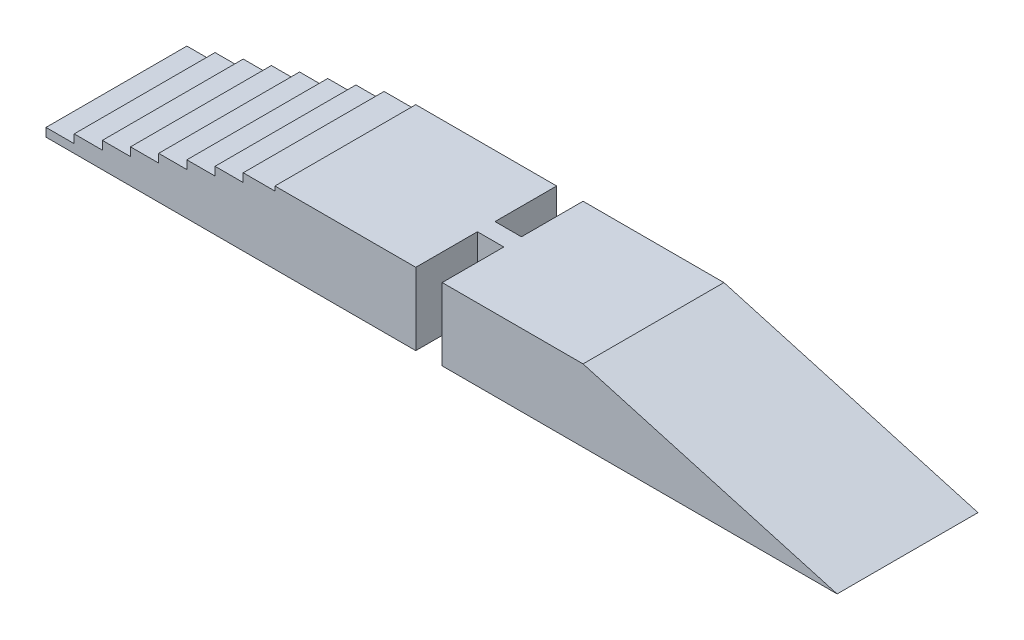
ISO-10303-21;
HEADER;
FILE_DESCRIPTION(('STEP AP214'),'2;1');
FILE_NAME('part.step','',(''),(''),'','','');
FILE_SCHEMA(('AUTOMOTIVE_DESIGN { 1 0 10303 214 1 1 1 1 }'));
ENDSEC;
DATA;
#1=APPLICATION_CONTEXT('core data for automotive mechanical design processes');
#2=APPLICATION_PROTOCOL_DEFINITION('international standard','automotive_design',2000,#1);
#3=PRODUCT_CONTEXT('',#1,'mechanical');
#4=PRODUCT('Part','Part','',(#3));
#5=PRODUCT_RELATED_PRODUCT_CATEGORY('part','',(#4));
#6=PRODUCT_DEFINITION_FORMATION('','',#4);
#7=PRODUCT_DEFINITION_CONTEXT('part definition',#1,'design');
#8=PRODUCT_DEFINITION('design','',#6,#7);
#9=PRODUCT_DEFINITION_SHAPE('','',#8);
#10=(LENGTH_UNIT() NAMED_UNIT(*) SI_UNIT(.MILLI.,.METRE.));
#11=(NAMED_UNIT(*) PLANE_ANGLE_UNIT() SI_UNIT($,.RADIAN.));
#12=(NAMED_UNIT(*) SI_UNIT($,.STERADIAN.) SOLID_ANGLE_UNIT());
#13=UNCERTAINTY_MEASURE_WITH_UNIT(LENGTH_MEASURE(1.E-05),#10,'distance_accuracy_value','');
#14=(GEOMETRIC_REPRESENTATION_CONTEXT(3) GLOBAL_UNCERTAINTY_ASSIGNED_CONTEXT((#13)) GLOBAL_UNIT_ASSIGNED_CONTEXT((#10,
#11,#12)) REPRESENTATION_CONTEXT('',''));
#15=CARTESIAN_POINT('',(0.,0.,0.));
#16=DIRECTION('',(0.,0.,1.));
#17=DIRECTION('',(1.,0.,0.));
#18=AXIS2_PLACEMENT_3D('',#15,#16,#17);
#19=CARTESIAN_POINT('',(-1186.89854742721,0.,800.));
#20=DIRECTION('',(0.,1.,0.));
#21=DIRECTION('',(0.,0.,1.));
#22=AXIS2_PLACEMENT_3D('',#19,#20,#21);
#23=PLANE('',#22);
#24=DIRECTION('',(0.,0.,-1.));
#25=VECTOR('',#24,1.);
#26=CARTESIAN_POINT('',(913.101452572792,0.,800.));
#27=LINE('',#26,#25);
#28=CARTESIAN_POINT('',(913.101452572792,0.,350.));
#29=VERTEX_POINT('',#28);
#30=CARTESIAN_POINT('',(913.101452572792,0.,0.));
#31=VERTEX_POINT('',#30);
#32=EDGE_CURVE('E275',#29,#31,#27,.T.);
#33=ORIENTED_EDGE('',*,*,#32,.F.);
#34=DIRECTION('',(1.,0.,0.));
#35=VECTOR('',#34,1.);
#36=CARTESIAN_POINT('',(-1186.89854742721,0.,350.));
#37=LINE('',#36,#35);
#38=CARTESIAN_POINT('',(1063.10145257279,0.,350.));
#39=VERTEX_POINT('',#38);
#40=EDGE_CURVE('E286',#29,#39,#37,.T.);
#41=ORIENTED_EDGE('',*,*,#40,.T.);
#42=DIRECTION('',(0.,0.,-1.));
#43=VECTOR('',#42,1.);
#44=CARTESIAN_POINT('',(1063.10145257279,0.,800.));
#45=LINE('',#44,#43);
#46=CARTESIAN_POINT('',(1063.10145257279,0.,0.));
#47=VERTEX_POINT('',#46);
#48=EDGE_CURVE('E227',#39,#47,#45,.T.);
#49=ORIENTED_EDGE('',*,*,#48,.T.);
#50=DIRECTION('',(1.,0.,0.));
#51=VECTOR('',#50,1.);
#52=CARTESIAN_POINT('',(-1186.89854742721,0.,0.));
#53=LINE('',#52,#51);
#54=CARTESIAN_POINT('',(3305.98051888431,0.,0.));
#55=VERTEX_POINT('',#54);
#56=EDGE_CURVE('E406',#47,#55,#53,.T.);
#57=ORIENTED_EDGE('',*,*,#56,.T.);
#58=DIRECTION('',(0.,0.,-1.));
#59=VECTOR('',#58,1.);
#60=CARTESIAN_POINT('',(3305.98051888431,0.,800.));
#61=LINE('',#60,#59);
#62=CARTESIAN_POINT('',(3305.98051888431,0.,800.));
#63=VERTEX_POINT('',#62);
#64=EDGE_CURVE('E419',#63,#55,#61,.T.);
#65=ORIENTED_EDGE('',*,*,#64,.F.);
#66=DIRECTION('',(1.,0.,0.));
#67=VECTOR('',#66,1.);
#68=CARTESIAN_POINT('',(-1186.89854742721,0.,800.));
#69=LINE('',#68,#67);
#70=CARTESIAN_POINT('',(1063.10145257279,0.,800.));
#71=VERTEX_POINT('',#70);
#72=EDGE_CURVE('E346',#71,#63,#69,.T.);
#73=ORIENTED_EDGE('',*,*,#72,.F.);
#74=DIRECTION('',(0.,0.,-1.));
#75=VECTOR('',#74,1.);
#76=CARTESIAN_POINT('',(1063.10145257279,0.,800.));
#77=LINE('',#76,#75);
#78=CARTESIAN_POINT('',(1063.10145257279,0.,450.));
#79=VERTEX_POINT('',#78);
#80=EDGE_CURVE('E55',#71,#79,#77,.T.);
#81=ORIENTED_EDGE('',*,*,#80,.T.);
#82=DIRECTION('',(1.,0.,0.));
#83=VECTOR('',#82,1.);
#84=CARTESIAN_POINT('',(-1186.89854742721,0.,450.));
#85=LINE('',#84,#83);
#86=CARTESIAN_POINT('',(913.101452572792,0.,450.));
#87=VERTEX_POINT('',#86);
#88=EDGE_CURVE('E283',#87,#79,#85,.T.);
#89=ORIENTED_EDGE('',*,*,#88,.F.);
#90=DIRECTION('',(0.,0.,-1.));
#91=VECTOR('',#90,1.);
#92=CARTESIAN_POINT('',(913.101452572792,0.,800.000000000001));
#93=LINE('',#92,#91);
#94=CARTESIAN_POINT('',(913.101452572792,0.,800.));
#95=VERTEX_POINT('',#94);
#96=EDGE_CURVE('E280',#95,#87,#93,.T.);
#97=ORIENTED_EDGE('',*,*,#96,.F.);
#98=CARTESIAN_POINT('',(-1186.89854742721,0.,800.));
#99=VERTEX_POINT('',#98);
#100=EDGE_CURVE('E347',#99,#95,#69,.T.);
#101=ORIENTED_EDGE('',*,*,#100,.F.);
#102=DIRECTION('',(0.,0.,-1.));
#103=VECTOR('',#102,1.);
#104=CARTESIAN_POINT('',(-1186.89854742721,0.,800.));
#105=LINE('',#104,#103);
#106=CARTESIAN_POINT('',(-1186.89854742721,0.,0.));
#107=VERTEX_POINT('',#106);
#108=EDGE_CURVE('E423',#99,#107,#105,.T.);
#109=ORIENTED_EDGE('',*,*,#108,.T.);
#110=EDGE_CURVE('E407',#107,#31,#53,.T.);
#111=ORIENTED_EDGE('',*,*,#110,.T.);
#112=EDGE_LOOP('',(#33,#41,#49,#57,#65,#73,#81,#89,#97,#101,#109,#111));
#113=FACE_BOUND('',#112,.T.);
#114=ADVANCED_FACE('F39',(#113),#23,.F.);
#115=CARTESIAN_POINT('',(1063.10145257279,410.,800.));
#116=DIRECTION('',(0.,-1.,0.));
#117=DIRECTION('',(0.,0.,-1.));
#118=AXIS2_PLACEMENT_3D('',#115,#116,#117);
#119=PLANE('',#118);
#120=DIRECTION('',(0.,0.,-1.));
#121=VECTOR('',#120,1.);
#122=CARTESIAN_POINT('',(913.101452572792,410.,0.));
#123=LINE('',#122,#121);
#124=CARTESIAN_POINT('',(913.101452572792,410.,350.));
#125=VERTEX_POINT('',#124);
#126=CARTESIAN_POINT('',(913.101452572792,410.,0.));
#127=VERTEX_POINT('',#126);
#128=EDGE_CURVE('E232',#125,#127,#123,.T.);
#129=ORIENTED_EDGE('',*,*,#128,.T.);
#130=DIRECTION('',(-1.,0.,0.));
#131=VECTOR('',#130,1.);
#132=CARTESIAN_POINT('',(1063.10145257279,410.,0.));
#133=LINE('',#132,#131);
#134=CARTESIAN_POINT('',(113.101452572792,410.,0.));
#135=VERTEX_POINT('',#134);
#136=EDGE_CURVE('E414',#127,#135,#133,.T.);
#137=ORIENTED_EDGE('',*,*,#136,.T.);
#138=DIRECTION('',(0.,0.,-1.));
#139=VECTOR('',#138,1.);
#140=CARTESIAN_POINT('',(113.101452572792,410.,800.));
#141=LINE('',#140,#139);
#142=CARTESIAN_POINT('',(113.101452572792,410.,800.));
#143=VERTEX_POINT('',#142);
#144=EDGE_CURVE('E491',#143,#135,#141,.T.);
#145=ORIENTED_EDGE('',*,*,#144,.F.);
#146=DIRECTION('',(-1.,0.,0.));
#147=VECTOR('',#146,1.);
#148=CARTESIAN_POINT('',(913.101452572792,410.,800.));
#149=LINE('',#148,#147);
#150=CARTESIAN_POINT('',(913.101452572792,410.,800.));
#151=VERTEX_POINT('',#150);
#152=EDGE_CURVE('E295',#151,#143,#149,.T.);
#153=ORIENTED_EDGE('',*,*,#152,.F.);
#154=DIRECTION('',(0.,0.,-1.));
#155=VECTOR('',#154,1.);
#156=CARTESIAN_POINT('',(913.101452572792,410.,2.89641787561426E-13));
#157=LINE('',#156,#155);
#158=CARTESIAN_POINT('',(913.101452572792,410.,450.));
#159=VERTEX_POINT('',#158);
#160=EDGE_CURVE('E264',#151,#159,#157,.T.);
#161=ORIENTED_EDGE('',*,*,#160,.T.);
#162=DIRECTION('',(1.,0.,0.));
#163=VECTOR('',#162,1.);
#164=CARTESIAN_POINT('',(0.,410.,450.));
#165=LINE('',#164,#163);
#166=CARTESIAN_POINT('',(1063.10145257279,410.,450.));
#167=VERTEX_POINT('',#166);
#168=EDGE_CURVE('E260',#159,#167,#165,.T.);
#169=ORIENTED_EDGE('',*,*,#168,.T.);
#170=DIRECTION('',(0.,0.,-1.));
#171=VECTOR('',#170,1.);
#172=CARTESIAN_POINT('',(1063.10145257279,410.,0.));
#173=LINE('',#172,#171);
#174=CARTESIAN_POINT('',(1063.10145257279,410.,800.));
#175=VERTEX_POINT('',#174);
#176=EDGE_CURVE('E256',#175,#167,#173,.T.);
#177=ORIENTED_EDGE('',*,*,#176,.F.);
#178=CARTESIAN_POINT('',(1863.10145257279,410.,800.));
#179=VERTEX_POINT('',#178);
#180=EDGE_CURVE('E290',#179,#175,#149,.T.);
#181=ORIENTED_EDGE('',*,*,#180,.F.);
#182=DIRECTION('',(0.,0.,-1.));
#183=VECTOR('',#182,1.);
#184=CARTESIAN_POINT('',(1863.10145257279,410.,800.));
#185=LINE('',#184,#183);
#186=CARTESIAN_POINT('',(1863.10145257279,410.,0.));
#187=VERTEX_POINT('',#186);
#188=EDGE_CURVE('E355',#179,#187,#185,.T.);
#189=ORIENTED_EDGE('',*,*,#188,.T.);
#190=CARTESIAN_POINT('',(1063.10145257279,410.,0.));
#191=VERTEX_POINT('',#190);
#192=EDGE_CURVE('E248',#187,#191,#133,.T.);
#193=ORIENTED_EDGE('',*,*,#192,.T.);
#194=DIRECTION('',(0.,0.,-1.));
#195=VECTOR('',#194,1.);
#196=CARTESIAN_POINT('',(1063.10145257279,410.,0.));
#197=LINE('',#196,#195);
#198=CARTESIAN_POINT('',(1063.10145257279,410.,350.));
#199=VERTEX_POINT('',#198);
#200=EDGE_CURVE('E63',#199,#191,#197,.T.);
#201=ORIENTED_EDGE('',*,*,#200,.F.);
#202=DIRECTION('',(1.,0.,0.));
#203=VECTOR('',#202,1.);
#204=CARTESIAN_POINT('',(0.,410.,350.));
#205=LINE('',#204,#203);
#206=EDGE_CURVE('E235',#125,#199,#205,.T.);
#207=ORIENTED_EDGE('',*,*,#206,.F.);
#208=EDGE_LOOP('',(#129,#137,#145,#153,#161,#169,#177,#181,#189,#193,#201,#207));
#209=FACE_BOUND('',#208,.T.);
#210=ADVANCED_FACE('F245',(#209),#119,.F.);
#211=CARTESIAN_POINT('',(0.,0.,800.));
#212=DIRECTION('',(0.,0.,-1.));
#213=DIRECTION('',(-1.,0.,0.));
#214=AXIS2_PLACEMENT_3D('',#211,#212,#213);
#215=PLANE('',#214);
#216=DIRECTION('',(0.,-1.,0.));
#217=VECTOR('',#216,1.);
#218=CARTESIAN_POINT('',(913.101452572792,0.,800.));
#219=LINE('',#218,#217);
#220=EDGE_CURVE('E11',#151,#95,#219,.T.);
#221=ORIENTED_EDGE('',*,*,#220,.F.);
#222=ORIENTED_EDGE('',*,*,#152,.T.);
#223=DIRECTION('',(0.,-1.,0.));
#224=VECTOR('',#223,1.);
#225=CARTESIAN_POINT('',(113.101452572792,385.,800.));
#226=LINE('',#225,#224);
#227=CARTESIAN_POINT('',(113.101452572792,385.,800.));
#228=VERTEX_POINT('',#227);
#229=EDGE_CURVE('E294',#143,#228,#226,.T.);
#230=ORIENTED_EDGE('',*,*,#229,.T.);
#231=DIRECTION('',(-1.,0.,0.));
#232=VECTOR('',#231,1.);
#233=CARTESIAN_POINT('',(-66.898547427208,385.,800.));
#234=LINE('',#233,#232);
#235=CARTESIAN_POINT('',(-66.898547427208,385.,800.));
#236=VERTEX_POINT('',#235);
#237=EDGE_CURVE('E298',#228,#236,#234,.T.);
#238=ORIENTED_EDGE('',*,*,#237,.T.);
#239=DIRECTION('',(0.,-1.,0.));
#240=VECTOR('',#239,1.);
#241=CARTESIAN_POINT('',(-66.898547427208,385.,800.));
#242=LINE('',#241,#240);
#243=CARTESIAN_POINT('',(-66.898547427208,336.875,800.));
#244=VERTEX_POINT('',#243);
#245=EDGE_CURVE('E301',#236,#244,#242,.T.);
#246=ORIENTED_EDGE('',*,*,#245,.T.);
#247=DIRECTION('',(-1.,0.,0.));
#248=VECTOR('',#247,1.);
#249=CARTESIAN_POINT('',(-226.898547427208,336.875,800.));
#250=LINE('',#249,#248);
#251=CARTESIAN_POINT('',(-226.898547427208,336.875,800.));
#252=VERTEX_POINT('',#251);
#253=EDGE_CURVE('E304',#244,#252,#250,.T.);
#254=ORIENTED_EDGE('',*,*,#253,.T.);
#255=DIRECTION('',(0.,-1.,0.));
#256=VECTOR('',#255,1.);
#257=CARTESIAN_POINT('',(-226.898547427208,336.875,800.));
#258=LINE('',#257,#256);
#259=CARTESIAN_POINT('',(-226.898547427208,288.75,800.));
#260=VERTEX_POINT('',#259);
#261=EDGE_CURVE('E307',#252,#260,#258,.T.);
#262=ORIENTED_EDGE('',*,*,#261,.T.);
#263=DIRECTION('',(-1.,0.,0.));
#264=VECTOR('',#263,1.);
#265=CARTESIAN_POINT('',(-386.898547427208,288.75,800.));
#266=LINE('',#265,#264);
#267=CARTESIAN_POINT('',(-386.898547427208,288.75,800.));
#268=VERTEX_POINT('',#267);
#269=EDGE_CURVE('E310',#260,#268,#266,.T.);
#270=ORIENTED_EDGE('',*,*,#269,.T.);
#271=DIRECTION('',(0.,-1.,0.));
#272=VECTOR('',#271,1.);
#273=CARTESIAN_POINT('',(-386.898547427208,288.75,800.));
#274=LINE('',#273,#272);
#275=CARTESIAN_POINT('',(-386.898547427208,240.625,800.));
#276=VERTEX_POINT('',#275);
#277=EDGE_CURVE('E313',#268,#276,#274,.T.);
#278=ORIENTED_EDGE('',*,*,#277,.T.);
#279=DIRECTION('',(-1.,0.,0.));
#280=VECTOR('',#279,1.);
#281=CARTESIAN_POINT('',(-546.898547427208,240.625,800.));
#282=LINE('',#281,#280);
#283=CARTESIAN_POINT('',(-546.898547427208,240.625,800.));
#284=VERTEX_POINT('',#283);
#285=EDGE_CURVE('E316',#276,#284,#282,.T.);
#286=ORIENTED_EDGE('',*,*,#285,.T.);
#287=DIRECTION('',(0.,-1.,0.));
#288=VECTOR('',#287,1.);
#289=CARTESIAN_POINT('',(-546.898547427208,240.625,800.));
#290=LINE('',#289,#288);
#291=CARTESIAN_POINT('',(-546.898547427208,192.5,800.));
#292=VERTEX_POINT('',#291);
#293=EDGE_CURVE('E319',#284,#292,#290,.T.);
#294=ORIENTED_EDGE('',*,*,#293,.T.);
#295=DIRECTION('',(-1.,0.,0.));
#296=VECTOR('',#295,1.);
#297=CARTESIAN_POINT('',(-706.898547427208,192.5,800.));
#298=LINE('',#297,#296);
#299=CARTESIAN_POINT('',(-706.898547427208,192.5,800.));
#300=VERTEX_POINT('',#299);
#301=EDGE_CURVE('E322',#292,#300,#298,.T.);
#302=ORIENTED_EDGE('',*,*,#301,.T.);
#303=DIRECTION('',(0.,-1.,0.));
#304=VECTOR('',#303,1.);
#305=CARTESIAN_POINT('',(-706.898547427208,192.5,800.));
#306=LINE('',#305,#304);
#307=CARTESIAN_POINT('',(-706.898547427208,144.375,800.));
#308=VERTEX_POINT('',#307);
#309=EDGE_CURVE('E325',#300,#308,#306,.T.);
#310=ORIENTED_EDGE('',*,*,#309,.T.);
#311=DIRECTION('',(-1.,0.,0.));
#312=VECTOR('',#311,1.);
#313=CARTESIAN_POINT('',(-866.898547427208,144.375,800.));
#314=LINE('',#313,#312);
#315=CARTESIAN_POINT('',(-866.898547427208,144.375,800.));
#316=VERTEX_POINT('',#315);
#317=EDGE_CURVE('E328',#308,#316,#314,.T.);
#318=ORIENTED_EDGE('',*,*,#317,.T.);
#319=DIRECTION('',(0.,-1.,0.));
#320=VECTOR('',#319,1.);
#321=CARTESIAN_POINT('',(-866.898547427208,144.375,800.));
#322=LINE('',#321,#320);
#323=CARTESIAN_POINT('',(-866.898547427208,96.25,800.));
#324=VERTEX_POINT('',#323);
#325=EDGE_CURVE('E331',#316,#324,#322,.T.);
#326=ORIENTED_EDGE('',*,*,#325,.T.);
#327=DIRECTION('',(-1.,0.,0.));
#328=VECTOR('',#327,1.);
#329=CARTESIAN_POINT('',(-1026.89854742721,96.25,800.));
#330=LINE('',#329,#328);
#331=CARTESIAN_POINT('',(-1026.89854742721,96.25,800.));
#332=VERTEX_POINT('',#331);
#333=EDGE_CURVE('E334',#324,#332,#330,.T.);
#334=ORIENTED_EDGE('',*,*,#333,.T.);
#335=DIRECTION('',(0.,-1.,0.));
#336=VECTOR('',#335,1.);
#337=CARTESIAN_POINT('',(-1026.89854742721,96.25,800.));
#338=LINE('',#337,#336);
#339=CARTESIAN_POINT('',(-1026.89854742721,48.125,800.));
#340=VERTEX_POINT('',#339);
#341=EDGE_CURVE('E337',#332,#340,#338,.T.);
#342=ORIENTED_EDGE('',*,*,#341,.T.);
#343=DIRECTION('',(-1.,0.,0.));
#344=VECTOR('',#343,1.);
#345=CARTESIAN_POINT('',(-1186.89854742721,48.125,800.));
#346=LINE('',#345,#344);
#347=CARTESIAN_POINT('',(-1186.89854742721,48.125,800.));
#348=VERTEX_POINT('',#347);
#349=EDGE_CURVE('E340',#340,#348,#346,.T.);
#350=ORIENTED_EDGE('',*,*,#349,.T.);
#351=DIRECTION('',(0.,-1.,0.));
#352=VECTOR('',#351,1.);
#353=CARTESIAN_POINT('',(-1186.89854742721,48.125,800.));
#354=LINE('',#353,#352);
#355=EDGE_CURVE('E343',#348,#99,#354,.T.);
#356=ORIENTED_EDGE('',*,*,#355,.T.);
#357=ORIENTED_EDGE('',*,*,#100,.T.);
#358=EDGE_LOOP('',(#221,#222,#230,#238,#246,#254,#262,#270,#278,#286,#294,#302,#310,#318,#326,
#334,#342,#350,#356,#357));
#359=FACE_BOUND('',#358,.T.);
#360=ADVANCED_FACE('F532',(#359),#215,.F.);
#361=CARTESIAN_POINT('',(0.,0.,0.));
#362=DIRECTION('',(0.,0.,-1.));
#363=DIRECTION('',(-1.,0.,0.));
#364=AXIS2_PLACEMENT_3D('',#361,#362,#363);
#365=PLANE('',#364);
#366=ORIENTED_EDGE('',*,*,#136,.F.);
#367=DIRECTION('',(0.,-1.,0.));
#368=VECTOR('',#367,1.);
#369=CARTESIAN_POINT('',(913.101452572792,0.,0.));
#370=LINE('',#369,#368);
#371=EDGE_CURVE('E498',#127,#31,#370,.T.);
#372=ORIENTED_EDGE('',*,*,#371,.T.);
#373=ORIENTED_EDGE('',*,*,#110,.F.);
#374=DIRECTION('',(0.,-1.,0.));
#375=VECTOR('',#374,1.);
#376=CARTESIAN_POINT('',(-1186.89854742721,48.125,0.));
#377=LINE('',#376,#375);
#378=CARTESIAN_POINT('',(-1186.89854742721,48.125,0.));
#379=VERTEX_POINT('',#378);
#380=EDGE_CURVE('E403',#379,#107,#377,.T.);
#381=ORIENTED_EDGE('',*,*,#380,.F.);
#382=DIRECTION('',(-1.,0.,0.));
#383=VECTOR('',#382,1.);
#384=CARTESIAN_POINT('',(-1186.89854742721,48.125,0.));
#385=LINE('',#384,#383);
#386=CARTESIAN_POINT('',(-1026.89854742721,48.125,0.));
#387=VERTEX_POINT('',#386);
#388=EDGE_CURVE('E400',#387,#379,#385,.T.);
#389=ORIENTED_EDGE('',*,*,#388,.F.);
#390=DIRECTION('',(0.,-1.,0.));
#391=VECTOR('',#390,1.);
#392=CARTESIAN_POINT('',(-1026.89854742721,96.25,0.));
#393=LINE('',#392,#391);
#394=CARTESIAN_POINT('',(-1026.89854742721,96.25,0.));
#395=VERTEX_POINT('',#394);
#396=EDGE_CURVE('E397',#395,#387,#393,.T.);
#397=ORIENTED_EDGE('',*,*,#396,.F.);
#398=DIRECTION('',(-1.,0.,0.));
#399=VECTOR('',#398,1.);
#400=CARTESIAN_POINT('',(-1026.89854742721,96.25,0.));
#401=LINE('',#400,#399);
#402=CARTESIAN_POINT('',(-866.898547427208,96.25,0.));
#403=VERTEX_POINT('',#402);
#404=EDGE_CURVE('E394',#403,#395,#401,.T.);
#405=ORIENTED_EDGE('',*,*,#404,.F.);
#406=DIRECTION('',(0.,-1.,0.));
#407=VECTOR('',#406,1.);
#408=CARTESIAN_POINT('',(-866.898547427208,144.375,0.));
#409=LINE('',#408,#407);
#410=CARTESIAN_POINT('',(-866.898547427208,144.375,0.));
#411=VERTEX_POINT('',#410);
#412=EDGE_CURVE('E391',#411,#403,#409,.T.);
#413=ORIENTED_EDGE('',*,*,#412,.F.);
#414=DIRECTION('',(-1.,0.,0.));
#415=VECTOR('',#414,1.);
#416=CARTESIAN_POINT('',(-866.898547427208,144.375,0.));
#417=LINE('',#416,#415);
#418=CARTESIAN_POINT('',(-706.898547427208,144.375,0.));
#419=VERTEX_POINT('',#418);
#420=EDGE_CURVE('E388',#419,#411,#417,.T.);
#421=ORIENTED_EDGE('',*,*,#420,.F.);
#422=DIRECTION('',(0.,-1.,0.));
#423=VECTOR('',#422,1.);
#424=CARTESIAN_POINT('',(-706.898547427208,192.5,0.));
#425=LINE('',#424,#423);
#426=CARTESIAN_POINT('',(-706.898547427208,192.5,0.));
#427=VERTEX_POINT('',#426);
#428=EDGE_CURVE('E385',#427,#419,#425,.T.);
#429=ORIENTED_EDGE('',*,*,#428,.F.);
#430=DIRECTION('',(-1.,0.,0.));
#431=VECTOR('',#430,1.);
#432=CARTESIAN_POINT('',(-706.898547427208,192.5,0.));
#433=LINE('',#432,#431);
#434=CARTESIAN_POINT('',(-546.898547427208,192.5,0.));
#435=VERTEX_POINT('',#434);
#436=EDGE_CURVE('E382',#435,#427,#433,.T.);
#437=ORIENTED_EDGE('',*,*,#436,.F.);
#438=DIRECTION('',(0.,-1.,0.));
#439=VECTOR('',#438,1.);
#440=CARTESIAN_POINT('',(-546.898547427208,240.625,0.));
#441=LINE('',#440,#439);
#442=CARTESIAN_POINT('',(-546.898547427208,240.625,0.));
#443=VERTEX_POINT('',#442);
#444=EDGE_CURVE('E379',#443,#435,#441,.T.);
#445=ORIENTED_EDGE('',*,*,#444,.F.);
#446=DIRECTION('',(-1.,0.,0.));
#447=VECTOR('',#446,1.);
#448=CARTESIAN_POINT('',(-546.898547427208,240.625,0.));
#449=LINE('',#448,#447);
#450=CARTESIAN_POINT('',(-386.898547427208,240.625,0.));
#451=VERTEX_POINT('',#450);
#452=EDGE_CURVE('E376',#451,#443,#449,.T.);
#453=ORIENTED_EDGE('',*,*,#452,.F.);
#454=DIRECTION('',(0.,-1.,0.));
#455=VECTOR('',#454,1.);
#456=CARTESIAN_POINT('',(-386.898547427208,288.75,0.));
#457=LINE('',#456,#455);
#458=CARTESIAN_POINT('',(-386.898547427208,288.75,0.));
#459=VERTEX_POINT('',#458);
#460=EDGE_CURVE('E373',#459,#451,#457,.T.);
#461=ORIENTED_EDGE('',*,*,#460,.F.);
#462=DIRECTION('',(-1.,0.,0.));
#463=VECTOR('',#462,1.);
#464=CARTESIAN_POINT('',(-386.898547427208,288.75,0.));
#465=LINE('',#464,#463);
#466=CARTESIAN_POINT('',(-226.898547427208,288.75,0.));
#467=VERTEX_POINT('',#466);
#468=EDGE_CURVE('E370',#467,#459,#465,.T.);
#469=ORIENTED_EDGE('',*,*,#468,.F.);
#470=DIRECTION('',(0.,-1.,0.));
#471=VECTOR('',#470,1.);
#472=CARTESIAN_POINT('',(-226.898547427208,336.875,0.));
#473=LINE('',#472,#471);
#474=CARTESIAN_POINT('',(-226.898547427208,336.875,0.));
#475=VERTEX_POINT('',#474);
#476=EDGE_CURVE('E367',#475,#467,#473,.T.);
#477=ORIENTED_EDGE('',*,*,#476,.F.);
#478=DIRECTION('',(-1.,0.,0.));
#479=VECTOR('',#478,1.);
#480=CARTESIAN_POINT('',(-226.898547427208,336.875,0.));
#481=LINE('',#480,#479);
#482=CARTESIAN_POINT('',(-66.898547427208,336.875,0.));
#483=VERTEX_POINT('',#482);
#484=EDGE_CURVE('E364',#483,#475,#481,.T.);
#485=ORIENTED_EDGE('',*,*,#484,.F.);
#486=DIRECTION('',(0.,-1.,0.));
#487=VECTOR('',#486,1.);
#488=CARTESIAN_POINT('',(-66.898547427208,385.,0.));
#489=LINE('',#488,#487);
#490=CARTESIAN_POINT('',(-66.898547427208,385.,0.));
#491=VERTEX_POINT('',#490);
#492=EDGE_CURVE('E361',#491,#483,#489,.T.);
#493=ORIENTED_EDGE('',*,*,#492,.F.);
#494=DIRECTION('',(-1.,0.,0.));
#495=VECTOR('',#494,1.);
#496=CARTESIAN_POINT('',(-66.898547427208,385.,0.));
#497=LINE('',#496,#495);
#498=CARTESIAN_POINT('',(113.101452572792,385.,0.));
#499=VERTEX_POINT('',#498);
#500=EDGE_CURVE('E358',#499,#491,#497,.T.);
#501=ORIENTED_EDGE('',*,*,#500,.F.);
#502=DIRECTION('',(0.,-1.,0.));
#503=VECTOR('',#502,1.);
#504=CARTESIAN_POINT('',(113.101452572792,385.,0.));
#505=LINE('',#504,#503);
#506=EDGE_CURVE('E289',#135,#499,#505,.T.);
#507=ORIENTED_EDGE('',*,*,#506,.F.);
#508=EDGE_LOOP('',(#366,#372,#373,#381,#389,#397,#405,#413,#421,#429,#437,#445,#453,#461,#469,
#477,#485,#493,#501,#507));
#509=FACE_BOUND('',#508,.T.);
#510=ADVANCED_FACE('F524',(#509),#365,.T.);
#511=CARTESIAN_POINT('',(113.101452572792,385.,800.));
#512=DIRECTION('',(1.,0.,0.));
#513=DIRECTION('',(0.,0.,-1.));
#514=AXIS2_PLACEMENT_3D('',#511,#512,#513);
#515=PLANE('',#514);
#516=ORIENTED_EDGE('',*,*,#506,.T.);
#517=DIRECTION('',(0.,0.,-1.));
#518=VECTOR('',#517,1.);
#519=CARTESIAN_POINT('',(113.101452572792,385.,800.));
#520=LINE('',#519,#518);
#521=EDGE_CURVE('E487',#228,#499,#520,.T.);
#522=ORIENTED_EDGE('',*,*,#521,.F.);
#523=ORIENTED_EDGE('',*,*,#229,.F.);
#524=ORIENTED_EDGE('',*,*,#144,.T.);
#525=EDGE_LOOP('',(#516,#522,#523,#524));
#526=FACE_BOUND('',#525,.T.);
#527=ADVANCED_FACE('F41',(#526),#515,.F.);
#528=CARTESIAN_POINT('',(-66.898547427208,385.,800.));
#529=DIRECTION('',(0.,-1.,0.));
#530=DIRECTION('',(0.,0.,-1.));
#531=AXIS2_PLACEMENT_3D('',#528,#529,#530);
#532=PLANE('',#531);
#533=ORIENTED_EDGE('',*,*,#500,.T.);
#534=DIRECTION('',(0.,0.,-1.));
#535=VECTOR('',#534,1.);
#536=CARTESIAN_POINT('',(-66.898547427208,385.,800.));
#537=LINE('',#536,#535);
#538=EDGE_CURVE('E483',#236,#491,#537,.T.);
#539=ORIENTED_EDGE('',*,*,#538,.F.);
#540=ORIENTED_EDGE('',*,*,#237,.F.);
#541=ORIENTED_EDGE('',*,*,#521,.T.);
#542=EDGE_LOOP('',(#533,#539,#540,#541));
#543=FACE_BOUND('',#542,.T.);
#544=ADVANCED_FACE('F601',(#543),#532,.F.);
#545=CARTESIAN_POINT('',(-66.898547427208,385.,800.));
#546=DIRECTION('',(1.,0.,0.));
#547=DIRECTION('',(0.,0.,-1.));
#548=AXIS2_PLACEMENT_3D('',#545,#546,#547);
#549=PLANE('',#548);
#550=ORIENTED_EDGE('',*,*,#492,.T.);
#551=DIRECTION('',(0.,0.,-1.));
#552=VECTOR('',#551,1.);
#553=CARTESIAN_POINT('',(-66.898547427208,336.875,800.));
#554=LINE('',#553,#552);
#555=EDGE_CURVE('E479',#244,#483,#554,.T.);
#556=ORIENTED_EDGE('',*,*,#555,.F.);
#557=ORIENTED_EDGE('',*,*,#245,.F.);
#558=ORIENTED_EDGE('',*,*,#538,.T.);
#559=EDGE_LOOP('',(#550,#556,#557,#558));
#560=FACE_BOUND('',#559,.T.);
#561=ADVANCED_FACE('F598',(#560),#549,.F.);
#562=CARTESIAN_POINT('',(-226.898547427208,336.875,800.));
#563=DIRECTION('',(0.,-1.,0.));
#564=DIRECTION('',(0.,0.,-1.));
#565=AXIS2_PLACEMENT_3D('',#562,#563,#564);
#566=PLANE('',#565);
#567=ORIENTED_EDGE('',*,*,#484,.T.);
#568=DIRECTION('',(0.,0.,-1.));
#569=VECTOR('',#568,1.);
#570=CARTESIAN_POINT('',(-226.898547427208,336.875,800.));
#571=LINE('',#570,#569);
#572=EDGE_CURVE('E475',#252,#475,#571,.T.);
#573=ORIENTED_EDGE('',*,*,#572,.F.);
#574=ORIENTED_EDGE('',*,*,#253,.F.);
#575=ORIENTED_EDGE('',*,*,#555,.T.);
#576=EDGE_LOOP('',(#567,#573,#574,#575));
#577=FACE_BOUND('',#576,.T.);
#578=ADVANCED_FACE('F594',(#577),#566,.F.);
#579=CARTESIAN_POINT('',(-226.898547427208,336.875,800.));
#580=DIRECTION('',(1.,0.,0.));
#581=DIRECTION('',(0.,0.,-1.));
#582=AXIS2_PLACEMENT_3D('',#579,#580,#581);
#583=PLANE('',#582);
#584=ORIENTED_EDGE('',*,*,#476,.T.);
#585=DIRECTION('',(0.,0.,-1.));
#586=VECTOR('',#585,1.);
#587=CARTESIAN_POINT('',(-226.898547427208,288.75,800.));
#588=LINE('',#587,#586);
#589=EDGE_CURVE('E471',#260,#467,#588,.T.);
#590=ORIENTED_EDGE('',*,*,#589,.F.);
#591=ORIENTED_EDGE('',*,*,#261,.F.);
#592=ORIENTED_EDGE('',*,*,#572,.T.);
#593=EDGE_LOOP('',(#584,#590,#591,#592));
#594=FACE_BOUND('',#593,.T.);
#595=ADVANCED_FACE('F590',(#594),#583,.F.);
#596=CARTESIAN_POINT('',(-386.898547427208,288.75,800.));
#597=DIRECTION('',(0.,-1.,0.));
#598=DIRECTION('',(1.,0.,0.));
#599=AXIS2_PLACEMENT_3D('',#596,#597,#598);
#600=PLANE('',#599);
#601=ORIENTED_EDGE('',*,*,#468,.T.);
#602=DIRECTION('',(0.,0.,-1.));
#603=VECTOR('',#602,1.);
#604=CARTESIAN_POINT('',(-386.898547427208,288.75,800.));
#605=LINE('',#604,#603);
#606=EDGE_CURVE('E467',#268,#459,#605,.T.);
#607=ORIENTED_EDGE('',*,*,#606,.F.);
#608=ORIENTED_EDGE('',*,*,#269,.F.);
#609=ORIENTED_EDGE('',*,*,#589,.T.);
#610=EDGE_LOOP('',(#601,#607,#608,#609));
#611=FACE_BOUND('',#610,.T.);
#612=ADVANCED_FACE('F586',(#611),#600,.F.);
#613=CARTESIAN_POINT('',(-386.898547427208,288.75,800.));
#614=DIRECTION('',(1.,0.,0.));
#615=DIRECTION('',(0.,0.,-1.));
#616=AXIS2_PLACEMENT_3D('',#613,#614,#615);
#617=PLANE('',#616);
#618=ORIENTED_EDGE('',*,*,#460,.T.);
#619=DIRECTION('',(0.,0.,-1.));
#620=VECTOR('',#619,1.);
#621=CARTESIAN_POINT('',(-386.898547427208,240.625,800.));
#622=LINE('',#621,#620);
#623=EDGE_CURVE('E463',#276,#451,#622,.T.);
#624=ORIENTED_EDGE('',*,*,#623,.F.);
#625=ORIENTED_EDGE('',*,*,#277,.F.);
#626=ORIENTED_EDGE('',*,*,#606,.T.);
#627=EDGE_LOOP('',(#618,#624,#625,#626));
#628=FACE_BOUND('',#627,.T.);
#629=ADVANCED_FACE('F582',(#628),#617,.F.);
#630=CARTESIAN_POINT('',(-546.898547427208,240.625,800.));
#631=DIRECTION('',(0.,-1.,0.));
#632=DIRECTION('',(1.,0.,0.));
#633=AXIS2_PLACEMENT_3D('',#630,#631,#632);
#634=PLANE('',#633);
#635=ORIENTED_EDGE('',*,*,#452,.T.);
#636=DIRECTION('',(0.,0.,-1.));
#637=VECTOR('',#636,1.);
#638=CARTESIAN_POINT('',(-546.898547427208,240.625,800.));
#639=LINE('',#638,#637);
#640=EDGE_CURVE('E459',#284,#443,#639,.T.);
#641=ORIENTED_EDGE('',*,*,#640,.F.);
#642=ORIENTED_EDGE('',*,*,#285,.F.);
#643=ORIENTED_EDGE('',*,*,#623,.T.);
#644=EDGE_LOOP('',(#635,#641,#642,#643));
#645=FACE_BOUND('',#644,.T.);
#646=ADVANCED_FACE('F578',(#645),#634,.F.);
#647=CARTESIAN_POINT('',(-546.898547427208,240.625,800.));
#648=DIRECTION('',(1.,0.,0.));
#649=DIRECTION('',(0.,0.,-1.));
#650=AXIS2_PLACEMENT_3D('',#647,#648,#649);
#651=PLANE('',#650);
#652=ORIENTED_EDGE('',*,*,#444,.T.);
#653=DIRECTION('',(0.,0.,-1.));
#654=VECTOR('',#653,1.);
#655=CARTESIAN_POINT('',(-546.898547427208,192.5,800.));
#656=LINE('',#655,#654);
#657=EDGE_CURVE('E455',#292,#435,#656,.T.);
#658=ORIENTED_EDGE('',*,*,#657,.F.);
#659=ORIENTED_EDGE('',*,*,#293,.F.);
#660=ORIENTED_EDGE('',*,*,#640,.T.);
#661=EDGE_LOOP('',(#652,#658,#659,#660));
#662=FACE_BOUND('',#661,.T.);
#663=ADVANCED_FACE('F574',(#662),#651,.F.);
#664=CARTESIAN_POINT('',(-706.898547427208,192.5,800.));
#665=DIRECTION('',(0.,-1.,0.));
#666=DIRECTION('',(0.,0.,-1.));
#667=AXIS2_PLACEMENT_3D('',#664,#665,#666);
#668=PLANE('',#667);
#669=ORIENTED_EDGE('',*,*,#436,.T.);
#670=DIRECTION('',(0.,0.,-1.));
#671=VECTOR('',#670,1.);
#672=CARTESIAN_POINT('',(-706.898547427208,192.5,800.));
#673=LINE('',#672,#671);
#674=EDGE_CURVE('E451',#300,#427,#673,.T.);
#675=ORIENTED_EDGE('',*,*,#674,.F.);
#676=ORIENTED_EDGE('',*,*,#301,.F.);
#677=ORIENTED_EDGE('',*,*,#657,.T.);
#678=EDGE_LOOP('',(#669,#675,#676,#677));
#679=FACE_BOUND('',#678,.T.);
#680=ADVANCED_FACE('F570',(#679),#668,.F.);
#681=CARTESIAN_POINT('',(-706.898547427208,192.5,800.));
#682=DIRECTION('',(1.,0.,0.));
#683=DIRECTION('',(0.,0.,-1.));
#684=AXIS2_PLACEMENT_3D('',#681,#682,#683);
#685=PLANE('',#684);
#686=ORIENTED_EDGE('',*,*,#428,.T.);
#687=DIRECTION('',(0.,0.,-1.));
#688=VECTOR('',#687,1.);
#689=CARTESIAN_POINT('',(-706.898547427208,144.375,800.));
#690=LINE('',#689,#688);
#691=EDGE_CURVE('E447',#308,#419,#690,.T.);
#692=ORIENTED_EDGE('',*,*,#691,.F.);
#693=ORIENTED_EDGE('',*,*,#309,.F.);
#694=ORIENTED_EDGE('',*,*,#674,.T.);
#695=EDGE_LOOP('',(#686,#692,#693,#694));
#696=FACE_BOUND('',#695,.T.);
#697=ADVANCED_FACE('F566',(#696),#685,.F.);
#698=CARTESIAN_POINT('',(-866.898547427208,144.375,800.));
#699=DIRECTION('',(0.,-1.,0.));
#700=DIRECTION('',(1.,0.,0.));
#701=AXIS2_PLACEMENT_3D('',#698,#699,#700);
#702=PLANE('',#701);
#703=ORIENTED_EDGE('',*,*,#420,.T.);
#704=DIRECTION('',(0.,0.,-1.));
#705=VECTOR('',#704,1.);
#706=CARTESIAN_POINT('',(-866.898547427208,144.375,800.));
#707=LINE('',#706,#705);
#708=EDGE_CURVE('E443',#316,#411,#707,.T.);
#709=ORIENTED_EDGE('',*,*,#708,.F.);
#710=ORIENTED_EDGE('',*,*,#317,.F.);
#711=ORIENTED_EDGE('',*,*,#691,.T.);
#712=EDGE_LOOP('',(#703,#709,#710,#711));
#713=FACE_BOUND('',#712,.T.);
#714=ADVANCED_FACE('F562',(#713),#702,.F.);
#715=CARTESIAN_POINT('',(-866.898547427208,144.375,800.));
#716=DIRECTION('',(1.,0.,0.));
#717=DIRECTION('',(0.,0.,-1.));
#718=AXIS2_PLACEMENT_3D('',#715,#716,#717);
#719=PLANE('',#718);
#720=ORIENTED_EDGE('',*,*,#412,.T.);
#721=DIRECTION('',(0.,0.,-1.));
#722=VECTOR('',#721,1.);
#723=CARTESIAN_POINT('',(-866.898547427208,96.25,800.));
#724=LINE('',#723,#722);
#725=EDGE_CURVE('E439',#324,#403,#724,.T.);
#726=ORIENTED_EDGE('',*,*,#725,.F.);
#727=ORIENTED_EDGE('',*,*,#325,.F.);
#728=ORIENTED_EDGE('',*,*,#708,.T.);
#729=EDGE_LOOP('',(#720,#726,#727,#728));
#730=FACE_BOUND('',#729,.T.);
#731=ADVANCED_FACE('F558',(#730),#719,.F.);
#732=CARTESIAN_POINT('',(-1026.89854742721,96.25,800.));
#733=DIRECTION('',(0.,-1.,0.));
#734=DIRECTION('',(0.,0.,-1.));
#735=AXIS2_PLACEMENT_3D('',#732,#733,#734);
#736=PLANE('',#735);
#737=ORIENTED_EDGE('',*,*,#404,.T.);
#738=DIRECTION('',(0.,0.,-1.));
#739=VECTOR('',#738,1.);
#740=CARTESIAN_POINT('',(-1026.89854742721,96.25,800.));
#741=LINE('',#740,#739);
#742=EDGE_CURVE('E435',#332,#395,#741,.T.);
#743=ORIENTED_EDGE('',*,*,#742,.F.);
#744=ORIENTED_EDGE('',*,*,#333,.F.);
#745=ORIENTED_EDGE('',*,*,#725,.T.);
#746=EDGE_LOOP('',(#737,#743,#744,#745));
#747=FACE_BOUND('',#746,.T.);
#748=ADVANCED_FACE('F554',(#747),#736,.F.);
#749=CARTESIAN_POINT('',(-1026.89854742721,96.25,800.));
#750=DIRECTION('',(1.,0.,0.));
#751=DIRECTION('',(0.,0.,-1.));
#752=AXIS2_PLACEMENT_3D('',#749,#750,#751);
#753=PLANE('',#752);
#754=ORIENTED_EDGE('',*,*,#396,.T.);
#755=DIRECTION('',(0.,0.,-1.));
#756=VECTOR('',#755,1.);
#757=CARTESIAN_POINT('',(-1026.89854742721,48.125,800.));
#758=LINE('',#757,#756);
#759=EDGE_CURVE('E431',#340,#387,#758,.T.);
#760=ORIENTED_EDGE('',*,*,#759,.F.);
#761=ORIENTED_EDGE('',*,*,#341,.F.);
#762=ORIENTED_EDGE('',*,*,#742,.T.);
#763=EDGE_LOOP('',(#754,#760,#761,#762));
#764=FACE_BOUND('',#763,.T.);
#765=ADVANCED_FACE('F550',(#764),#753,.F.);
#766=CARTESIAN_POINT('',(-1186.89854742721,48.125,800.));
#767=DIRECTION('',(0.,-1.,0.));
#768=DIRECTION('',(0.,0.,-1.));
#769=AXIS2_PLACEMENT_3D('',#766,#767,#768);
#770=PLANE('',#769);
#771=ORIENTED_EDGE('',*,*,#388,.T.);
#772=DIRECTION('',(0.,0.,-1.));
#773=VECTOR('',#772,1.);
#774=CARTESIAN_POINT('',(-1186.89854742721,48.125,800.));
#775=LINE('',#774,#773);
#776=EDGE_CURVE('E427',#348,#379,#775,.T.);
#777=ORIENTED_EDGE('',*,*,#776,.F.);
#778=ORIENTED_EDGE('',*,*,#349,.F.);
#779=ORIENTED_EDGE('',*,*,#759,.T.);
#780=EDGE_LOOP('',(#771,#777,#778,#779));
#781=FACE_BOUND('',#780,.T.);
#782=ADVANCED_FACE('F546',(#781),#770,.F.);
#783=CARTESIAN_POINT('',(-1186.89854742721,48.125,800.));
#784=DIRECTION('',(1.,0.,0.));
#785=DIRECTION('',(0.,0.,-1.));
#786=AXIS2_PLACEMENT_3D('',#783,#784,#785);
#787=PLANE('',#786);
#788=ORIENTED_EDGE('',*,*,#380,.T.);
#789=ORIENTED_EDGE('',*,*,#108,.F.);
#790=ORIENTED_EDGE('',*,*,#355,.F.);
#791=ORIENTED_EDGE('',*,*,#776,.T.);
#792=EDGE_LOOP('',(#788,#789,#790,#791));
#793=FACE_BOUND('',#792,.T.);
#794=ADVANCED_FACE('F543',(#793),#787,.F.);
#795=CARTESIAN_POINT('',(1863.10145257279,410.,800.));
#796=DIRECTION('',(-0.273333333333333,-0.961919377541012,0.));
#797=DIRECTION('',(0.961919377541012,-0.273333333333333,0.));
#798=AXIS2_PLACEMENT_3D('',#795,#796,#797);
#799=PLANE('',#798);
#800=DIRECTION('',(-0.961919377541012,0.273333333333333,0.));
#801=VECTOR('',#800,1.);
#802=CARTESIAN_POINT('',(1863.10145257279,410.,0.));
#803=LINE('',#802,#801);
#804=EDGE_CURVE('E411',#55,#187,#803,.T.);
#805=ORIENTED_EDGE('',*,*,#804,.T.);
#806=ORIENTED_EDGE('',*,*,#188,.F.);
#807=DIRECTION('',(-0.961919377541012,0.273333333333333,0.));
#808=VECTOR('',#807,1.);
#809=CARTESIAN_POINT('',(1863.10145257279,410.,800.));
#810=LINE('',#809,#808);
#811=EDGE_CURVE('E351',#63,#179,#810,.T.);
#812=ORIENTED_EDGE('',*,*,#811,.F.);
#813=ORIENTED_EDGE('',*,*,#64,.T.);
#814=EDGE_LOOP('',(#805,#806,#812,#813));
#815=FACE_BOUND('',#814,.T.);
#816=ADVANCED_FACE('F519',(#815),#799,.F.);
#817=ORIENTED_EDGE('',*,*,#180,.T.);
#818=DIRECTION('',(0.,-1.,0.));
#819=VECTOR('',#818,1.);
#820=CARTESIAN_POINT('',(1063.10145257279,0.,800.));
#821=LINE('',#820,#819);
#822=EDGE_CURVE('E48',#175,#71,#821,.T.);
#823=ORIENTED_EDGE('',*,*,#822,.T.);
#824=ORIENTED_EDGE('',*,*,#72,.T.);
#825=ORIENTED_EDGE('',*,*,#811,.T.);
#826=EDGE_LOOP('',(#817,#823,#824,#825));
#827=FACE_BOUND('',#826,.T.);
#828=ADVANCED_FACE('F504',(#827),#215,.F.);
#829=DIRECTION('',(0.,-1.,0.));
#830=VECTOR('',#829,1.);
#831=CARTESIAN_POINT('',(1063.10145257279,0.,0.));
#832=LINE('',#831,#830);
#833=EDGE_CURVE('E495',#191,#47,#832,.T.);
#834=ORIENTED_EDGE('',*,*,#833,.F.);
#835=ORIENTED_EDGE('',*,*,#192,.F.);
#836=ORIENTED_EDGE('',*,*,#804,.F.);
#837=ORIENTED_EDGE('',*,*,#56,.F.);
#838=EDGE_LOOP('',(#834,#835,#836,#837));
#839=FACE_BOUND('',#838,.T.);
#840=ADVANCED_FACE('F521',(#839),#365,.T.);
#841=CARTESIAN_POINT('',(0.,-390.,350.));
#842=DIRECTION('',(0.,0.,1.));
#843=DIRECTION('',(1.,0.,0.));
#844=AXIS2_PLACEMENT_3D('',#841,#842,#843);
#845=PLANE('',#844);
#846=DIRECTION('',(0.,1.,0.));
#847=VECTOR('',#846,1.);
#848=CARTESIAN_POINT('',(913.101452572792,-390.,350.));
#849=LINE('',#848,#847);
#850=EDGE_CURVE('E231',#29,#125,#849,.T.);
#851=ORIENTED_EDGE('',*,*,#850,.T.);
#852=ORIENTED_EDGE('',*,*,#206,.T.);
#853=DIRECTION('',(0.,1.,0.));
#854=VECTOR('',#853,1.);
#855=CARTESIAN_POINT('',(1063.10145257279,-390.,350.));
#856=LINE('',#855,#854);
#857=EDGE_CURVE('E223',#39,#199,#856,.T.);
#858=ORIENTED_EDGE('',*,*,#857,.F.);
#859=ORIENTED_EDGE('',*,*,#40,.F.);
#860=EDGE_LOOP('',(#851,#852,#858,#859));
#861=FACE_BOUND('',#860,.T.);
#862=ADVANCED_FACE('F236',(#861),#845,.F.);
#863=CARTESIAN_POINT('',(913.101452572792,-390.,0.));
#864=DIRECTION('',(1.,0.,0.));
#865=DIRECTION('',(0.,0.,-1.));
#866=AXIS2_PLACEMENT_3D('',#863,#864,#865);
#867=PLANE('',#866);
#868=ORIENTED_EDGE('',*,*,#32,.T.);
#869=ORIENTED_EDGE('',*,*,#371,.F.);
#870=ORIENTED_EDGE('',*,*,#128,.F.);
#871=ORIENTED_EDGE('',*,*,#850,.F.);
#872=EDGE_LOOP('',(#868,#869,#870,#871));
#873=FACE_BOUND('',#872,.T.);
#874=ADVANCED_FACE('F529',(#873),#867,.T.);
#875=CARTESIAN_POINT('',(1063.10145257279,-390.,0.));
#876=DIRECTION('',(1.,0.,0.));
#877=DIRECTION('',(0.,0.,-1.));
#878=AXIS2_PLACEMENT_3D('',#875,#876,#877);
#879=PLANE('',#878);
#880=ORIENTED_EDGE('',*,*,#857,.T.);
#881=ORIENTED_EDGE('',*,*,#200,.T.);
#882=ORIENTED_EDGE('',*,*,#833,.T.);
#883=ORIENTED_EDGE('',*,*,#48,.F.);
#884=EDGE_LOOP('',(#880,#881,#882,#883));
#885=FACE_BOUND('',#884,.T.);
#886=ADVANCED_FACE('F225',(#885),#879,.F.);
#887=CARTESIAN_POINT('',(0.,-390.,450.));
#888=DIRECTION('',(0.,0.,1.));
#889=DIRECTION('',(1.,0.,0.));
#890=AXIS2_PLACEMENT_3D('',#887,#888,#889);
#891=PLANE('',#890);
#892=ORIENTED_EDGE('',*,*,#88,.T.);
#893=DIRECTION('',(0.,1.,0.));
#894=VECTOR('',#893,1.);
#895=CARTESIAN_POINT('',(1063.10145257279,-390.,450.));
#896=LINE('',#895,#894);
#897=EDGE_CURVE('E268',#79,#167,#896,.T.);
#898=ORIENTED_EDGE('',*,*,#897,.T.);
#899=ORIENTED_EDGE('',*,*,#168,.F.);
#900=DIRECTION('',(0.,1.,0.));
#901=VECTOR('',#900,1.);
#902=CARTESIAN_POINT('',(913.101452572792,-390.,450.));
#903=LINE('',#902,#901);
#904=EDGE_CURVE('E242',#87,#159,#903,.T.);
#905=ORIENTED_EDGE('',*,*,#904,.F.);
#906=EDGE_LOOP('',(#892,#898,#899,#905));
#907=FACE_BOUND('',#906,.T.);
#908=ADVANCED_FACE('F674',(#907),#891,.T.);
#909=CARTESIAN_POINT('',(913.101452572792,-390.,2.89641787561426E-13));
#910=DIRECTION('',(1.,0.,0.));
#911=DIRECTION('',(0.,0.,-1.));
#912=AXIS2_PLACEMENT_3D('',#909,#910,#911);
#913=PLANE('',#912);
#914=ORIENTED_EDGE('',*,*,#96,.T.);
#915=ORIENTED_EDGE('',*,*,#904,.T.);
#916=ORIENTED_EDGE('',*,*,#160,.F.);
#917=ORIENTED_EDGE('',*,*,#220,.T.);
#918=EDGE_LOOP('',(#914,#915,#916,#917));
#919=FACE_BOUND('',#918,.T.);
#920=ADVANCED_FACE('F671',(#919),#913,.T.);
#921=CARTESIAN_POINT('',(1063.10145257279,-390.,0.));
#922=DIRECTION('',(1.,0.,0.));
#923=DIRECTION('',(0.,0.,-1.));
#924=AXIS2_PLACEMENT_3D('',#921,#922,#923);
#925=PLANE('',#924);
#926=ORIENTED_EDGE('',*,*,#822,.F.);
#927=ORIENTED_EDGE('',*,*,#176,.T.);
#928=ORIENTED_EDGE('',*,*,#897,.F.);
#929=ORIENTED_EDGE('',*,*,#80,.F.);
#930=EDGE_LOOP('',(#926,#927,#928,#929));
#931=FACE_BOUND('',#930,.T.);
#932=ADVANCED_FACE('F675',(#931),#925,.F.);
#933=CLOSED_SHELL('',(#114,#210,#360,#510,#527,#544,#561,#578,#595,#612,#629,#646,#663,#680,
#697,#714,#731,#748,#765,#782,#794,#816,#828,#840,#862,#874,#886,#908,#920,#932));
#934=MANIFOLD_SOLID_BREP('B2',#933);
#935=ADVANCED_BREP_SHAPE_REPRESENTATION('',(#18,#934),#14);
#936=SHAPE_DEFINITION_REPRESENTATION(#9,#935);
ENDSEC;
END-ISO-10303-21;
